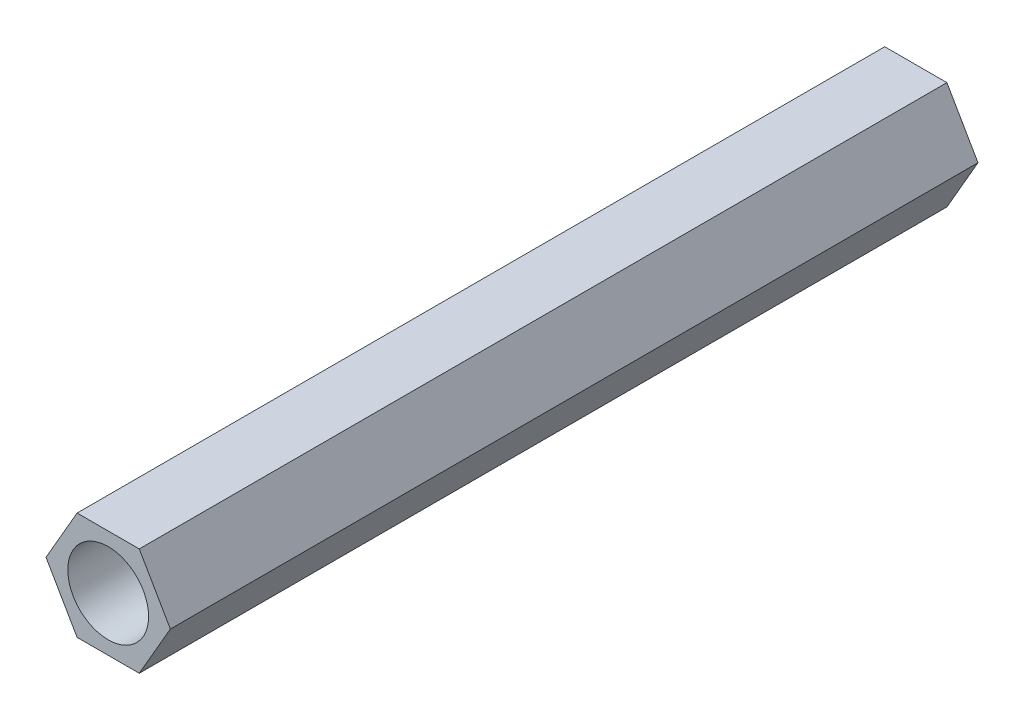
ISO-10303-21;
HEADER;
FILE_DESCRIPTION(('STEP AP214'),'2;1');
FILE_NAME('part.step','',(''),(''),'','','');
FILE_SCHEMA(('AUTOMOTIVE_DESIGN { 1 0 10303 214 1 1 1 1 }'));
ENDSEC;
DATA;
#1=APPLICATION_CONTEXT('core data for automotive mechanical design processes');
#2=APPLICATION_PROTOCOL_DEFINITION('international standard','automotive_design',2000,#1);
#3=PRODUCT_CONTEXT('',#1,'mechanical');
#4=PRODUCT('Part','Part','',(#3));
#5=PRODUCT_RELATED_PRODUCT_CATEGORY('part','',(#4));
#6=PRODUCT_DEFINITION_FORMATION('','',#4);
#7=PRODUCT_DEFINITION_CONTEXT('part definition',#1,'design');
#8=PRODUCT_DEFINITION('design','',#6,#7);
#9=PRODUCT_DEFINITION_SHAPE('','',#8);
#10=(LENGTH_UNIT() NAMED_UNIT(*) SI_UNIT(.MILLI.,.METRE.));
#11=(NAMED_UNIT(*) PLANE_ANGLE_UNIT() SI_UNIT($,.RADIAN.));
#12=(NAMED_UNIT(*) SI_UNIT($,.STERADIAN.) SOLID_ANGLE_UNIT());
#13=UNCERTAINTY_MEASURE_WITH_UNIT(LENGTH_MEASURE(1.E-05),#10,'distance_accuracy_value','');
#14=(GEOMETRIC_REPRESENTATION_CONTEXT(3) GLOBAL_UNCERTAINTY_ASSIGNED_CONTEXT((#13)) GLOBAL_UNIT_ASSIGNED_CONTEXT((#10,
#11,#12)) REPRESENTATION_CONTEXT('',''));
#15=CARTESIAN_POINT('',(0.,0.,0.));
#16=DIRECTION('',(0.,0.,1.));
#17=DIRECTION('',(1.,0.,0.));
#18=AXIS2_PLACEMENT_3D('',#15,#16,#17);
#19=CARTESIAN_POINT('',(0.,0.,30.));
#20=DIRECTION('',(0.,0.,1.));
#21=DIRECTION('',(1.,0.,0.));
#22=AXIS2_PLACEMENT_3D('',#19,#20,#21);
#23=PLANE('',#22);
#24=DIRECTION('',(0.5,0.866025403784439,0.));
#25=VECTOR('',#24,1.);
#26=CARTESIAN_POINT('',(1.15470053837925,-2.,30.));
#27=LINE('',#26,#25);
#28=CARTESIAN_POINT('',(1.15470053837925,-2.,30.));
#29=VERTEX_POINT('',#28);
#30=CARTESIAN_POINT('',(2.3094010767585,0.,30.));
#31=VERTEX_POINT('',#30);
#32=EDGE_CURVE('E150',#29,#31,#27,.T.);
#33=ORIENTED_EDGE('',*,*,#32,.T.);
#34=DIRECTION('',(-0.5,0.866025403784439,0.));
#35=VECTOR('',#34,1.);
#36=CARTESIAN_POINT('',(2.3094010767585,0.,30.));
#37=LINE('',#36,#35);
#38=CARTESIAN_POINT('',(1.15470053837925,2.,30.));
#39=VERTEX_POINT('',#38);
#40=EDGE_CURVE('E98',#31,#39,#37,.T.);
#41=ORIENTED_EDGE('',*,*,#40,.T.);
#42=DIRECTION('',(-1.,0.,0.));
#43=VECTOR('',#42,1.);
#44=CARTESIAN_POINT('',(1.15470053837925,2.,30.));
#45=LINE('',#44,#43);
#46=CARTESIAN_POINT('',(-1.15470053837925,2.,30.));
#47=VERTEX_POINT('',#46);
#48=EDGE_CURVE('E111',#39,#47,#45,.T.);
#49=ORIENTED_EDGE('',*,*,#48,.T.);
#50=DIRECTION('',(-0.5,-0.866025403784439,0.));
#51=VECTOR('',#50,1.);
#52=CARTESIAN_POINT('',(-1.15470053837925,2.,30.));
#53=LINE('',#52,#51);
#54=CARTESIAN_POINT('',(-2.3094010767585,0.,30.));
#55=VERTEX_POINT('',#54);
#56=EDGE_CURVE('E105',#47,#55,#53,.T.);
#57=ORIENTED_EDGE('',*,*,#56,.T.);
#58=DIRECTION('',(0.5,-0.866025403784438,0.));
#59=VECTOR('',#58,1.);
#60=CARTESIAN_POINT('',(-2.3094010767585,0.,30.));
#61=LINE('',#60,#59);
#62=CARTESIAN_POINT('',(-1.15470053837925,-2.,30.));
#63=VERTEX_POINT('',#62);
#64=EDGE_CURVE('E109',#55,#63,#61,.T.);
#65=ORIENTED_EDGE('',*,*,#64,.T.);
#66=DIRECTION('',(1.,0.,0.));
#67=VECTOR('',#66,1.);
#68=CARTESIAN_POINT('',(-1.15470053837925,-2.,30.));
#69=LINE('',#68,#67);
#70=EDGE_CURVE('E61',#63,#29,#69,.T.);
#71=ORIENTED_EDGE('',*,*,#70,.T.);
#72=EDGE_LOOP('',(#33,#41,#49,#57,#65,#71));
#73=FACE_BOUND('',#72,.T.);
#74=CARTESIAN_POINT('',(0.,0.,30.));
#75=DIRECTION('',(0.,0.,1.));
#76=DIRECTION('',(1.,0.,0.));
#77=AXIS2_PLACEMENT_3D('',#74,#75,#76);
#78=CIRCLE('',#77,1.5);
#79=CARTESIAN_POINT('',(1.5,0.,30.));
#80=VERTEX_POINT('',#79);
#81=EDGE_CURVE('E138',#80,#80,#78,.T.);
#82=ORIENTED_EDGE('',*,*,#81,.F.);
#83=EDGE_LOOP('',(#82));
#84=FACE_BOUND('',#83,.T.);
#85=ADVANCED_FACE('F43',(#73,#84),#23,.T.);
#86=CARTESIAN_POINT('',(0.,0.,0.));
#87=DIRECTION('',(0.,0.,1.));
#88=DIRECTION('',(1.,0.,0.));
#89=AXIS2_PLACEMENT_3D('',#86,#87,#88);
#90=PLANE('',#89);
#91=DIRECTION('',(0.5,0.866025403784439,0.));
#92=VECTOR('',#91,1.);
#93=CARTESIAN_POINT('',(1.15470053837925,-2.,0.));
#94=LINE('',#93,#92);
#95=CARTESIAN_POINT('',(1.15470053837925,-2.,0.));
#96=VERTEX_POINT('',#95);
#97=CARTESIAN_POINT('',(2.3094010767585,0.,0.));
#98=VERTEX_POINT('',#97);
#99=EDGE_CURVE('E133',#96,#98,#94,.T.);
#100=ORIENTED_EDGE('',*,*,#99,.F.);
#101=DIRECTION('',(1.,0.,0.));
#102=VECTOR('',#101,1.);
#103=CARTESIAN_POINT('',(-1.15470053837925,-2.,0.));
#104=LINE('',#103,#102);
#105=CARTESIAN_POINT('',(-1.15470053837925,-2.,0.));
#106=VERTEX_POINT('',#105);
#107=EDGE_CURVE('E90',#106,#96,#104,.T.);
#108=ORIENTED_EDGE('',*,*,#107,.F.);
#109=DIRECTION('',(0.5,-0.866025403784438,0.));
#110=VECTOR('',#109,1.);
#111=CARTESIAN_POINT('',(-2.3094010767585,0.,0.));
#112=LINE('',#111,#110);
#113=CARTESIAN_POINT('',(-2.3094010767585,0.,0.));
#114=VERTEX_POINT('',#113);
#115=EDGE_CURVE('E84',#114,#106,#112,.T.);
#116=ORIENTED_EDGE('',*,*,#115,.F.);
#117=DIRECTION('',(-0.5,-0.866025403784439,0.));
#118=VECTOR('',#117,1.);
#119=CARTESIAN_POINT('',(-1.15470053837925,2.,0.));
#120=LINE('',#119,#118);
#121=CARTESIAN_POINT('',(-1.15470053837925,2.,0.));
#122=VERTEX_POINT('',#121);
#123=EDGE_CURVE('E120',#122,#114,#120,.T.);
#124=ORIENTED_EDGE('',*,*,#123,.F.);
#125=DIRECTION('',(-1.,0.,0.));
#126=VECTOR('',#125,1.);
#127=CARTESIAN_POINT('',(1.15470053837925,2.,0.));
#128=LINE('',#127,#126);
#129=CARTESIAN_POINT('',(1.15470053837925,2.,0.));
#130=VERTEX_POINT('',#129);
#131=EDGE_CURVE('E141',#130,#122,#128,.T.);
#132=ORIENTED_EDGE('',*,*,#131,.F.);
#133=DIRECTION('',(-0.5,0.866025403784439,0.));
#134=VECTOR('',#133,1.);
#135=CARTESIAN_POINT('',(2.3094010767585,0.,0.));
#136=LINE('',#135,#134);
#137=EDGE_CURVE('E137',#98,#130,#136,.T.);
#138=ORIENTED_EDGE('',*,*,#137,.F.);
#139=EDGE_LOOP('',(#100,#108,#116,#124,#132,#138));
#140=FACE_BOUND('',#139,.T.);
#141=CARTESIAN_POINT('',(0.,0.,0.));
#142=DIRECTION('',(0.,0.,1.));
#143=DIRECTION('',(1.,0.,0.));
#144=AXIS2_PLACEMENT_3D('',#141,#142,#143);
#145=CIRCLE('',#144,1.5);
#146=CARTESIAN_POINT('',(1.5,0.,0.));
#147=VERTEX_POINT('',#146);
#148=EDGE_CURVE('E265',#147,#147,#145,.T.);
#149=ORIENTED_EDGE('',*,*,#148,.T.);
#150=EDGE_LOOP('',(#149));
#151=FACE_BOUND('',#150,.T.);
#152=ADVANCED_FACE('F163',(#140,#151),#90,.F.);
#153=CARTESIAN_POINT('',(1.15470053837925,-2.,30.));
#154=DIRECTION('',(-0.866025403784439,0.5,0.));
#155=DIRECTION('',(-0.5,-0.866025403784439,0.));
#156=AXIS2_PLACEMENT_3D('',#153,#154,#155);
#157=PLANE('',#156);
#158=ORIENTED_EDGE('',*,*,#99,.T.);
#159=DIRECTION('',(0.,0.,-1.));
#160=VECTOR('',#159,1.);
#161=CARTESIAN_POINT('',(2.3094010767585,0.,30.));
#162=LINE('',#161,#160);
#163=EDGE_CURVE('E11',#31,#98,#162,.T.);
#164=ORIENTED_EDGE('',*,*,#163,.F.);
#165=ORIENTED_EDGE('',*,*,#32,.F.);
#166=DIRECTION('',(0.,0.,-1.));
#167=VECTOR('',#166,1.);
#168=CARTESIAN_POINT('',(1.15470053837925,-2.,30.));
#169=LINE('',#168,#167);
#170=EDGE_CURVE('E129',#29,#96,#169,.T.);
#171=ORIENTED_EDGE('',*,*,#170,.T.);
#172=EDGE_LOOP('',(#158,#164,#165,#171));
#173=FACE_BOUND('',#172,.T.);
#174=ADVANCED_FACE('F45',(#173),#157,.F.);
#175=CARTESIAN_POINT('',(2.3094010767585,0.,30.));
#176=DIRECTION('',(-0.866025403784439,-0.5,0.));
#177=DIRECTION('',(0.5,-0.866025403784439,0.));
#178=AXIS2_PLACEMENT_3D('',#175,#176,#177);
#179=PLANE('',#178);
#180=ORIENTED_EDGE('',*,*,#137,.T.);
#181=DIRECTION('',(0.,0.,-1.));
#182=VECTOR('',#181,1.);
#183=CARTESIAN_POINT('',(1.15470053837925,2.,30.));
#184=LINE('',#183,#182);
#185=EDGE_CURVE('E53',#39,#130,#184,.T.);
#186=ORIENTED_EDGE('',*,*,#185,.F.);
#187=ORIENTED_EDGE('',*,*,#40,.F.);
#188=ORIENTED_EDGE('',*,*,#163,.T.);
#189=EDGE_LOOP('',(#180,#186,#187,#188));
#190=FACE_BOUND('',#189,.T.);
#191=ADVANCED_FACE('F188',(#190),#179,.F.);
#192=CARTESIAN_POINT('',(1.15470053837925,2.,30.));
#193=DIRECTION('',(0.,-1.,0.));
#194=DIRECTION('',(0.,0.,-1.));
#195=AXIS2_PLACEMENT_3D('',#192,#193,#194);
#196=PLANE('',#195);
#197=ORIENTED_EDGE('',*,*,#131,.T.);
#198=DIRECTION('',(0.,0.,-1.));
#199=VECTOR('',#198,1.);
#200=CARTESIAN_POINT('',(-1.15470053837925,2.,30.));
#201=LINE('',#200,#199);
#202=EDGE_CURVE('E122',#47,#122,#201,.T.);
#203=ORIENTED_EDGE('',*,*,#202,.F.);
#204=ORIENTED_EDGE('',*,*,#48,.F.);
#205=ORIENTED_EDGE('',*,*,#185,.T.);
#206=EDGE_LOOP('',(#197,#203,#204,#205));
#207=FACE_BOUND('',#206,.T.);
#208=ADVANCED_FACE('F160',(#207),#196,.F.);
#209=CARTESIAN_POINT('',(-1.15470053837925,2.,30.));
#210=DIRECTION('',(0.866025403784439,-0.5,0.));
#211=DIRECTION('',(0.5,0.866025403784439,0.));
#212=AXIS2_PLACEMENT_3D('',#209,#210,#211);
#213=PLANE('',#212);
#214=ORIENTED_EDGE('',*,*,#123,.T.);
#215=DIRECTION('',(0.,0.,-1.));
#216=VECTOR('',#215,1.);
#217=CARTESIAN_POINT('',(-2.3094010767585,0.,30.));
#218=LINE('',#217,#216);
#219=EDGE_CURVE('E117',#55,#114,#218,.T.);
#220=ORIENTED_EDGE('',*,*,#219,.F.);
#221=ORIENTED_EDGE('',*,*,#56,.F.);
#222=ORIENTED_EDGE('',*,*,#202,.T.);
#223=EDGE_LOOP('',(#214,#220,#221,#222));
#224=FACE_BOUND('',#223,.T.);
#225=ADVANCED_FACE('F118',(#224),#213,.F.);
#226=CARTESIAN_POINT('',(-2.3094010767585,0.,30.));
#227=DIRECTION('',(0.866025403784438,0.5,0.));
#228=DIRECTION('',(-0.5,0.866025403784438,0.));
#229=AXIS2_PLACEMENT_3D('',#226,#227,#228);
#230=PLANE('',#229);
#231=ORIENTED_EDGE('',*,*,#115,.T.);
#232=DIRECTION('',(0.,0.,-1.));
#233=VECTOR('',#232,1.);
#234=CARTESIAN_POINT('',(-1.15470053837925,-2.,30.));
#235=LINE('',#234,#233);
#236=EDGE_CURVE('E123',#63,#106,#235,.T.);
#237=ORIENTED_EDGE('',*,*,#236,.F.);
#238=ORIENTED_EDGE('',*,*,#64,.F.);
#239=ORIENTED_EDGE('',*,*,#219,.T.);
#240=EDGE_LOOP('',(#231,#237,#238,#239));
#241=FACE_BOUND('',#240,.T.);
#242=ADVANCED_FACE('F125',(#241),#230,.F.);
#243=CARTESIAN_POINT('',(-1.15470053837925,-2.,30.));
#244=DIRECTION('',(0.,1.,0.));
#245=DIRECTION('',(0.,0.,1.));
#246=AXIS2_PLACEMENT_3D('',#243,#244,#245);
#247=PLANE('',#246);
#248=ORIENTED_EDGE('',*,*,#107,.T.);
#249=ORIENTED_EDGE('',*,*,#170,.F.);
#250=ORIENTED_EDGE('',*,*,#70,.F.);
#251=ORIENTED_EDGE('',*,*,#236,.T.);
#252=EDGE_LOOP('',(#248,#249,#250,#251));
#253=FACE_BOUND('',#252,.T.);
#254=ADVANCED_FACE('F168',(#253),#247,.F.);
#255=CARTESIAN_POINT('',(0.,0.,30.));
#256=DIRECTION('',(0.,0.,-1.));
#257=DIRECTION('',(-1.,0.,0.));
#258=AXIS2_PLACEMENT_3D('',#255,#256,#257);
#259=CYLINDRICAL_SURFACE('',#258,1.5);
#260=ORIENTED_EDGE('',*,*,#81,.T.);
#261=EDGE_LOOP('',(#260));
#262=FACE_BOUND('',#261,.T.);
#263=ORIENTED_EDGE('',*,*,#148,.F.);
#264=EDGE_LOOP('',(#263));
#265=FACE_BOUND('',#264,.T.);
#266=ADVANCED_FACE('F170',(#262,#265),#259,.F.);
#267=CLOSED_SHELL('',(#85,#152,#174,#191,#208,#225,#242,#254,#266));
#268=MANIFOLD_SOLID_BREP('B2',#267);
#269=ADVANCED_BREP_SHAPE_REPRESENTATION('',(#18,#268),#14);
#270=SHAPE_DEFINITION_REPRESENTATION(#9,#269);
ENDSEC;
END-ISO-10303-21;
